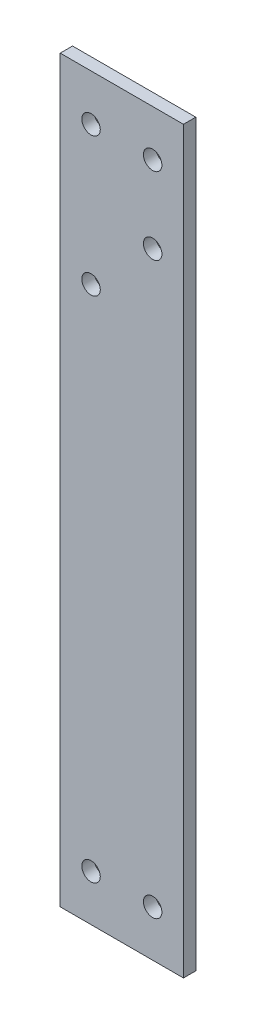
ISO-10303-21;
HEADER;
FILE_DESCRIPTION(('STEP AP214'),'2;1');
FILE_NAME('part.step','',(''),(''),'','','');
FILE_SCHEMA(('AUTOMOTIVE_DESIGN { 1 0 10303 214 1 1 1 1 }'));
ENDSEC;
DATA;
#1=APPLICATION_CONTEXT('core data for automotive mechanical design processes');
#2=APPLICATION_PROTOCOL_DEFINITION('international standard','automotive_design',2000,#1);
#3=PRODUCT_CONTEXT('',#1,'mechanical');
#4=PRODUCT('Part','Part','',(#3));
#5=PRODUCT_RELATED_PRODUCT_CATEGORY('part','',(#4));
#6=PRODUCT_DEFINITION_FORMATION('','',#4);
#7=PRODUCT_DEFINITION_CONTEXT('part definition',#1,'design');
#8=PRODUCT_DEFINITION('design','',#6,#7);
#9=PRODUCT_DEFINITION_SHAPE('','',#8);
#10=(LENGTH_UNIT() NAMED_UNIT(*) SI_UNIT(.MILLI.,.METRE.));
#11=(NAMED_UNIT(*) PLANE_ANGLE_UNIT() SI_UNIT($,.RADIAN.));
#12=(NAMED_UNIT(*) SI_UNIT($,.STERADIAN.) SOLID_ANGLE_UNIT());
#13=UNCERTAINTY_MEASURE_WITH_UNIT(LENGTH_MEASURE(1.E-05),#10,'distance_accuracy_value','');
#14=(GEOMETRIC_REPRESENTATION_CONTEXT(3) GLOBAL_UNCERTAINTY_ASSIGNED_CONTEXT((#13)) GLOBAL_UNIT_ASSIGNED_CONTEXT((#10,
#11,#12)) REPRESENTATION_CONTEXT('',''));
#15=CARTESIAN_POINT('',(0.,0.,0.));
#16=DIRECTION('',(0.,0.,1.));
#17=DIRECTION('',(1.,0.,0.));
#18=AXIS2_PLACEMENT_3D('',#15,#16,#17);
#19=CARTESIAN_POINT('',(9.99999999999999,60.,2.));
#20=DIRECTION('',(-1.,0.,0.));
#21=DIRECTION('',(0.,-1.,0.));
#22=AXIS2_PLACEMENT_3D('',#19,#20,#21);
#23=PLANE('',#22);
#24=DIRECTION('',(0.,1.,0.));
#25=VECTOR('',#24,1.);
#26=CARTESIAN_POINT('',(9.99999999999999,60.,0.));
#27=LINE('',#26,#25);
#28=CARTESIAN_POINT('',(10.,-60.,0.));
#29=VERTEX_POINT('',#28);
#30=CARTESIAN_POINT('',(9.99999999999999,60.,0.));
#31=VERTEX_POINT('',#30);
#32=EDGE_CURVE('E94',#29,#31,#27,.T.);
#33=ORIENTED_EDGE('',*,*,#32,.T.);
#34=DIRECTION('',(0.,0.,-1.));
#35=VECTOR('',#34,1.);
#36=CARTESIAN_POINT('',(9.99999999999999,60.,2.));
#37=LINE('',#36,#35);
#38=CARTESIAN_POINT('',(9.99999999999999,60.,2.));
#39=VERTEX_POINT('',#38);
#40=EDGE_CURVE('E11',#39,#31,#37,.T.);
#41=ORIENTED_EDGE('',*,*,#40,.F.);
#42=DIRECTION('',(0.,1.,0.));
#43=VECTOR('',#42,1.);
#44=CARTESIAN_POINT('',(9.99999999999999,60.,2.));
#45=LINE('',#44,#43);
#46=CARTESIAN_POINT('',(10.,-60.,2.));
#47=VERTEX_POINT('',#46);
#48=EDGE_CURVE('E82',#47,#39,#45,.T.);
#49=ORIENTED_EDGE('',*,*,#48,.F.);
#50=DIRECTION('',(0.,0.,-1.));
#51=VECTOR('',#50,1.);
#52=CARTESIAN_POINT('',(10.,-60.,2.));
#53=LINE('',#52,#51);
#54=EDGE_CURVE('E90',#47,#29,#53,.T.);
#55=ORIENTED_EDGE('',*,*,#54,.T.);
#56=EDGE_LOOP('',(#33,#41,#49,#55));
#57=FACE_BOUND('',#56,.T.);
#58=ADVANCED_FACE('F31',(#57),#23,.F.);
#59=CARTESIAN_POINT('',(-10.,60.,2.));
#60=DIRECTION('',(0.,-1.,0.));
#61=DIRECTION('',(0.,0.,-1.));
#62=AXIS2_PLACEMENT_3D('',#59,#60,#61);
#63=PLANE('',#62);
#64=DIRECTION('',(-1.,0.,0.));
#65=VECTOR('',#64,1.);
#66=CARTESIAN_POINT('',(-10.,60.,0.));
#67=LINE('',#66,#65);
#68=CARTESIAN_POINT('',(-10.,60.,0.));
#69=VERTEX_POINT('',#68);
#70=EDGE_CURVE('E86',#31,#69,#67,.T.);
#71=ORIENTED_EDGE('',*,*,#70,.T.);
#72=DIRECTION('',(0.,0.,-1.));
#73=VECTOR('',#72,1.);
#74=CARTESIAN_POINT('',(-10.,60.,2.));
#75=LINE('',#74,#73);
#76=CARTESIAN_POINT('',(-10.,60.,2.));
#77=VERTEX_POINT('',#76);
#78=EDGE_CURVE('E39',#77,#69,#75,.T.);
#79=ORIENTED_EDGE('',*,*,#78,.F.);
#80=DIRECTION('',(-1.,0.,0.));
#81=VECTOR('',#80,1.);
#82=CARTESIAN_POINT('',(-10.,60.,2.));
#83=LINE('',#82,#81);
#84=EDGE_CURVE('E77',#39,#77,#83,.T.);
#85=ORIENTED_EDGE('',*,*,#84,.F.);
#86=ORIENTED_EDGE('',*,*,#40,.T.);
#87=EDGE_LOOP('',(#71,#79,#85,#86));
#88=FACE_BOUND('',#87,.T.);
#89=ADVANCED_FACE('F85',(#88),#63,.F.);
#90=CARTESIAN_POINT('',(-10.,60.,2.));
#91=DIRECTION('',(1.,0.,0.));
#92=DIRECTION('',(0.,1.,0.));
#93=AXIS2_PLACEMENT_3D('',#90,#91,#92);
#94=PLANE('',#93);
#95=DIRECTION('',(0.,-1.,0.));
#96=VECTOR('',#95,1.);
#97=CARTESIAN_POINT('',(-10.,60.,0.));
#98=LINE('',#97,#96);
#99=CARTESIAN_POINT('',(-9.99999999999999,-60.,0.));
#100=VERTEX_POINT('',#99);
#101=EDGE_CURVE('E64',#69,#100,#98,.T.);
#102=ORIENTED_EDGE('',*,*,#101,.T.);
#103=DIRECTION('',(0.,0.,-1.));
#104=VECTOR('',#103,1.);
#105=CARTESIAN_POINT('',(-9.99999999999999,-60.,2.));
#106=LINE('',#105,#104);
#107=CARTESIAN_POINT('',(-9.99999999999999,-60.,2.));
#108=VERTEX_POINT('',#107);
#109=EDGE_CURVE('E87',#108,#100,#106,.T.);
#110=ORIENTED_EDGE('',*,*,#109,.F.);
#111=DIRECTION('',(0.,-1.,0.));
#112=VECTOR('',#111,1.);
#113=CARTESIAN_POINT('',(-10.,60.,2.));
#114=LINE('',#113,#112);
#115=EDGE_CURVE('E80',#77,#108,#114,.T.);
#116=ORIENTED_EDGE('',*,*,#115,.F.);
#117=ORIENTED_EDGE('',*,*,#78,.T.);
#118=EDGE_LOOP('',(#102,#110,#116,#117));
#119=FACE_BOUND('',#118,.T.);
#120=ADVANCED_FACE('F88',(#119),#94,.F.);
#121=CARTESIAN_POINT('',(-9.99999999999999,-60.,2.));
#122=DIRECTION('',(0.,1.,0.));
#123=DIRECTION('',(0.,0.,1.));
#124=AXIS2_PLACEMENT_3D('',#121,#122,#123);
#125=PLANE('',#124);
#126=DIRECTION('',(1.,0.,0.));
#127=VECTOR('',#126,1.);
#128=CARTESIAN_POINT('',(-9.99999999999999,-60.,0.));
#129=LINE('',#128,#127);
#130=EDGE_CURVE('E70',#100,#29,#129,.T.);
#131=ORIENTED_EDGE('',*,*,#130,.T.);
#132=ORIENTED_EDGE('',*,*,#54,.F.);
#133=DIRECTION('',(1.,0.,0.));
#134=VECTOR('',#133,1.);
#135=CARTESIAN_POINT('',(-9.99999999999999,-60.,2.));
#136=LINE('',#135,#134);
#137=EDGE_CURVE('E47',#108,#47,#136,.T.);
#138=ORIENTED_EDGE('',*,*,#137,.F.);
#139=ORIENTED_EDGE('',*,*,#109,.T.);
#140=EDGE_LOOP('',(#131,#132,#138,#139));
#141=FACE_BOUND('',#140,.T.);
#142=ADVANCED_FACE('F102',(#141),#125,.F.);
#143=CARTESIAN_POINT('',(10.,-60.,2.));
#144=DIRECTION('',(0.,0.,1.));
#145=DIRECTION('',(1.,0.,0.));
#146=AXIS2_PLACEMENT_3D('',#143,#144,#145);
#147=PLANE('',#146);
#148=CARTESIAN_POINT('',(-5.,30.,2.));
#149=DIRECTION('',(0.,0.,-1.));
#150=DIRECTION('',(-1.,0.,0.));
#151=AXIS2_PLACEMENT_3D('',#148,#149,#150);
#152=CIRCLE('',#151,1.5);
#153=CARTESIAN_POINT('',(-6.5,30.,2.));
#154=VERTEX_POINT('',#153);
#155=EDGE_CURVE('E135',#154,#154,#152,.T.);
#156=ORIENTED_EDGE('',*,*,#155,.T.);
#157=EDGE_LOOP('',(#156));
#158=FACE_BOUND('',#157,.T.);
#159=CARTESIAN_POINT('',(5.,40.,2.));
#160=DIRECTION('',(0.,0.,-1.));
#161=DIRECTION('',(-1.,0.,0.));
#162=AXIS2_PLACEMENT_3D('',#159,#160,#161);
#163=CIRCLE('',#162,1.5);
#164=CARTESIAN_POINT('',(3.5,40.,2.));
#165=VERTEX_POINT('',#164);
#166=EDGE_CURVE('E131',#165,#165,#163,.T.);
#167=ORIENTED_EDGE('',*,*,#166,.T.);
#168=EDGE_LOOP('',(#167));
#169=FACE_BOUND('',#168,.T.);
#170=CARTESIAN_POINT('',(5.00000000000002,-52.5,2.));
#171=DIRECTION('',(0.,0.,1.));
#172=DIRECTION('',(1.,0.,0.));
#173=AXIS2_PLACEMENT_3D('',#170,#171,#172);
#174=CIRCLE('',#173,1.5);
#175=CARTESIAN_POINT('',(6.50000000000002,-52.5,2.));
#176=VERTEX_POINT('',#175);
#177=EDGE_CURVE('E123',#176,#176,#174,.T.);
#178=ORIENTED_EDGE('',*,*,#177,.F.);
#179=EDGE_LOOP('',(#178));
#180=FACE_BOUND('',#179,.T.);
#181=CARTESIAN_POINT('',(-4.99999999999999,-52.5,2.));
#182=DIRECTION('',(0.,0.,1.));
#183=DIRECTION('',(1.,0.,0.));
#184=AXIS2_PLACEMENT_3D('',#181,#182,#183);
#185=CIRCLE('',#184,1.5);
#186=CARTESIAN_POINT('',(-3.49999999999999,-52.5,2.));
#187=VERTEX_POINT('',#186);
#188=EDGE_CURVE('E120',#187,#187,#185,.T.);
#189=ORIENTED_EDGE('',*,*,#188,.F.);
#190=EDGE_LOOP('',(#189));
#191=FACE_BOUND('',#190,.T.);
#192=CARTESIAN_POINT('',(5.00000000000001,52.5,2.));
#193=DIRECTION('',(0.,0.,1.));
#194=DIRECTION('',(1.,0.,0.));
#195=AXIS2_PLACEMENT_3D('',#192,#193,#194);
#196=CIRCLE('',#195,1.5);
#197=CARTESIAN_POINT('',(6.50000000000001,52.5,2.));
#198=VERTEX_POINT('',#197);
#199=EDGE_CURVE('E114',#198,#198,#196,.T.);
#200=ORIENTED_EDGE('',*,*,#199,.F.);
#201=EDGE_LOOP('',(#200));
#202=FACE_BOUND('',#201,.T.);
#203=CARTESIAN_POINT('',(-5.00000000000001,52.5,2.));
#204=DIRECTION('',(0.,0.,1.));
#205=DIRECTION('',(1.,0.,0.));
#206=AXIS2_PLACEMENT_3D('',#203,#204,#205);
#207=CIRCLE('',#206,1.5);
#208=CARTESIAN_POINT('',(-3.5,52.5,2.));
#209=VERTEX_POINT('',#208);
#210=EDGE_CURVE('E108',#209,#209,#207,.T.);
#211=ORIENTED_EDGE('',*,*,#210,.F.);
#212=EDGE_LOOP('',(#211));
#213=FACE_BOUND('',#212,.T.);
#214=ORIENTED_EDGE('',*,*,#48,.T.);
#215=ORIENTED_EDGE('',*,*,#84,.T.);
#216=ORIENTED_EDGE('',*,*,#115,.T.);
#217=ORIENTED_EDGE('',*,*,#137,.T.);
#218=EDGE_LOOP('',(#214,#215,#216,#217));
#219=FACE_BOUND('',#218,.T.);
#220=ADVANCED_FACE('F78',(#158,#169,#180,#191,#202,#213,#219),#147,.T.);
#221=CARTESIAN_POINT('',(10.,-60.,0.));
#222=DIRECTION('',(0.,0.,1.));
#223=DIRECTION('',(1.,0.,0.));
#224=AXIS2_PLACEMENT_3D('',#221,#222,#223);
#225=PLANE('',#224);
#226=CARTESIAN_POINT('',(-5.,30.,0.));
#227=DIRECTION('',(0.,0.,-1.));
#228=DIRECTION('',(-1.,0.,0.));
#229=AXIS2_PLACEMENT_3D('',#226,#227,#228);
#230=CIRCLE('',#229,1.5);
#231=CARTESIAN_POINT('',(-6.5,30.,0.));
#232=VERTEX_POINT('',#231);
#233=EDGE_CURVE('E138',#232,#232,#230,.T.);
#234=ORIENTED_EDGE('',*,*,#233,.F.);
#235=EDGE_LOOP('',(#234));
#236=FACE_BOUND('',#235,.T.);
#237=CARTESIAN_POINT('',(5.,40.,0.));
#238=DIRECTION('',(0.,0.,-1.));
#239=DIRECTION('',(-1.,0.,0.));
#240=AXIS2_PLACEMENT_3D('',#237,#238,#239);
#241=CIRCLE('',#240,1.5);
#242=CARTESIAN_POINT('',(3.5,40.,0.));
#243=VERTEX_POINT('',#242);
#244=EDGE_CURVE('E132',#243,#243,#241,.T.);
#245=ORIENTED_EDGE('',*,*,#244,.F.);
#246=EDGE_LOOP('',(#245));
#247=FACE_BOUND('',#246,.T.);
#248=CARTESIAN_POINT('',(5.00000000000002,-52.5,0.));
#249=DIRECTION('',(0.,0.,1.));
#250=DIRECTION('',(1.,0.,0.));
#251=AXIS2_PLACEMENT_3D('',#248,#249,#250);
#252=CIRCLE('',#251,1.5);
#253=CARTESIAN_POINT('',(6.50000000000002,-52.5,0.));
#254=VERTEX_POINT('',#253);
#255=EDGE_CURVE('E128',#254,#254,#252,.T.);
#256=ORIENTED_EDGE('',*,*,#255,.T.);
#257=EDGE_LOOP('',(#256));
#258=FACE_BOUND('',#257,.T.);
#259=CARTESIAN_POINT('',(-4.99999999999999,-52.5,0.));
#260=DIRECTION('',(0.,0.,1.));
#261=DIRECTION('',(1.,0.,0.));
#262=AXIS2_PLACEMENT_3D('',#259,#260,#261);
#263=CIRCLE('',#262,1.5);
#264=CARTESIAN_POINT('',(-3.49999999999999,-52.5,0.));
#265=VERTEX_POINT('',#264);
#266=EDGE_CURVE('E117',#265,#265,#263,.T.);
#267=ORIENTED_EDGE('',*,*,#266,.T.);
#268=EDGE_LOOP('',(#267));
#269=FACE_BOUND('',#268,.T.);
#270=CARTESIAN_POINT('',(5.00000000000001,52.5,0.));
#271=DIRECTION('',(0.,0.,1.));
#272=DIRECTION('',(1.,0.,0.));
#273=AXIS2_PLACEMENT_3D('',#270,#271,#272);
#274=CIRCLE('',#273,1.5);
#275=CARTESIAN_POINT('',(6.50000000000001,52.5,0.));
#276=VERTEX_POINT('',#275);
#277=EDGE_CURVE('E111',#276,#276,#274,.T.);
#278=ORIENTED_EDGE('',*,*,#277,.T.);
#279=EDGE_LOOP('',(#278));
#280=FACE_BOUND('',#279,.T.);
#281=CARTESIAN_POINT('',(-5.00000000000001,52.5,0.));
#282=DIRECTION('',(0.,0.,1.));
#283=DIRECTION('',(1.,0.,0.));
#284=AXIS2_PLACEMENT_3D('',#281,#282,#283);
#285=CIRCLE('',#284,1.5);
#286=CARTESIAN_POINT('',(-3.5,52.5,0.));
#287=VERTEX_POINT('',#286);
#288=EDGE_CURVE('E97',#287,#287,#285,.T.);
#289=ORIENTED_EDGE('',*,*,#288,.T.);
#290=EDGE_LOOP('',(#289));
#291=FACE_BOUND('',#290,.T.);
#292=ORIENTED_EDGE('',*,*,#32,.F.);
#293=ORIENTED_EDGE('',*,*,#130,.F.);
#294=ORIENTED_EDGE('',*,*,#101,.F.);
#295=ORIENTED_EDGE('',*,*,#70,.F.);
#296=EDGE_LOOP('',(#292,#293,#294,#295));
#297=FACE_BOUND('',#296,.T.);
#298=ADVANCED_FACE('F105',(#236,#247,#258,#269,#280,#291,#297),#225,.F.);
#299=CARTESIAN_POINT('',(-5.00000000000001,52.5,0.));
#300=DIRECTION('',(0.,0.,1.));
#301=DIRECTION('',(1.,0.,0.));
#302=AXIS2_PLACEMENT_3D('',#299,#300,#301);
#303=CYLINDRICAL_SURFACE('',#302,1.5);
#304=ORIENTED_EDGE('',*,*,#288,.F.);
#305=EDGE_LOOP('',(#304));
#306=FACE_BOUND('',#305,.T.);
#307=ORIENTED_EDGE('',*,*,#210,.T.);
#308=EDGE_LOOP('',(#307));
#309=FACE_BOUND('',#308,.T.);
#310=ADVANCED_FACE('F155',(#306,#309),#303,.F.);
#311=CARTESIAN_POINT('',(5.00000000000001,52.5,0.));
#312=DIRECTION('',(0.,0.,1.));
#313=DIRECTION('',(1.,0.,0.));
#314=AXIS2_PLACEMENT_3D('',#311,#312,#313);
#315=CYLINDRICAL_SURFACE('',#314,1.5);
#316=ORIENTED_EDGE('',*,*,#277,.F.);
#317=EDGE_LOOP('',(#316));
#318=FACE_BOUND('',#317,.T.);
#319=ORIENTED_EDGE('',*,*,#199,.T.);
#320=EDGE_LOOP('',(#319));
#321=FACE_BOUND('',#320,.T.);
#322=ADVANCED_FACE('F169',(#318,#321),#315,.F.);
#323=CARTESIAN_POINT('',(-4.99999999999999,-52.5,0.));
#324=DIRECTION('',(0.,0.,1.));
#325=DIRECTION('',(1.,0.,0.));
#326=AXIS2_PLACEMENT_3D('',#323,#324,#325);
#327=CYLINDRICAL_SURFACE('',#326,1.5);
#328=ORIENTED_EDGE('',*,*,#266,.F.);
#329=EDGE_LOOP('',(#328));
#330=FACE_BOUND('',#329,.T.);
#331=ORIENTED_EDGE('',*,*,#188,.T.);
#332=EDGE_LOOP('',(#331));
#333=FACE_BOUND('',#332,.T.);
#334=ADVANCED_FACE('F210',(#330,#333),#327,.F.);
#335=CARTESIAN_POINT('',(5.00000000000002,-52.5,0.));
#336=DIRECTION('',(0.,0.,1.));
#337=DIRECTION('',(1.,0.,0.));
#338=AXIS2_PLACEMENT_3D('',#335,#336,#337);
#339=CYLINDRICAL_SURFACE('',#338,1.5);
#340=ORIENTED_EDGE('',*,*,#255,.F.);
#341=EDGE_LOOP('',(#340));
#342=FACE_BOUND('',#341,.T.);
#343=ORIENTED_EDGE('',*,*,#177,.T.);
#344=EDGE_LOOP('',(#343));
#345=FACE_BOUND('',#344,.T.);
#346=ADVANCED_FACE('F220',(#342,#345),#339,.F.);
#347=CARTESIAN_POINT('',(5.,40.,2.));
#348=DIRECTION('',(0.,0.,-1.));
#349=DIRECTION('',(-1.,0.,0.));
#350=AXIS2_PLACEMENT_3D('',#347,#348,#349);
#351=CYLINDRICAL_SURFACE('',#350,1.5);
#352=ORIENTED_EDGE('',*,*,#166,.F.);
#353=EDGE_LOOP('',(#352));
#354=FACE_BOUND('',#353,.T.);
#355=ORIENTED_EDGE('',*,*,#244,.T.);
#356=EDGE_LOOP('',(#355));
#357=FACE_BOUND('',#356,.T.);
#358=ADVANCED_FACE('F149',(#354,#357),#351,.F.);
#359=CARTESIAN_POINT('',(-5.,30.,2.));
#360=DIRECTION('',(0.,0.,-1.));
#361=DIRECTION('',(-1.,0.,0.));
#362=AXIS2_PLACEMENT_3D('',#359,#360,#361);
#363=CYLINDRICAL_SURFACE('',#362,1.5);
#364=ORIENTED_EDGE('',*,*,#155,.F.);
#365=EDGE_LOOP('',(#364));
#366=FACE_BOUND('',#365,.T.);
#367=ORIENTED_EDGE('',*,*,#233,.T.);
#368=EDGE_LOOP('',(#367));
#369=FACE_BOUND('',#368,.T.);
#370=ADVANCED_FACE('F146',(#366,#369),#363,.F.);
#371=CLOSED_SHELL('',(#58,#89,#120,#142,#220,#298,#310,#322,#334,#346,#358,#370));
#372=MANIFOLD_SOLID_BREP('B2',#371);
#373=ADVANCED_BREP_SHAPE_REPRESENTATION('',(#18,#372),#14);
#374=SHAPE_DEFINITION_REPRESENTATION(#9,#373);
ENDSEC;
END-ISO-10303-21;
